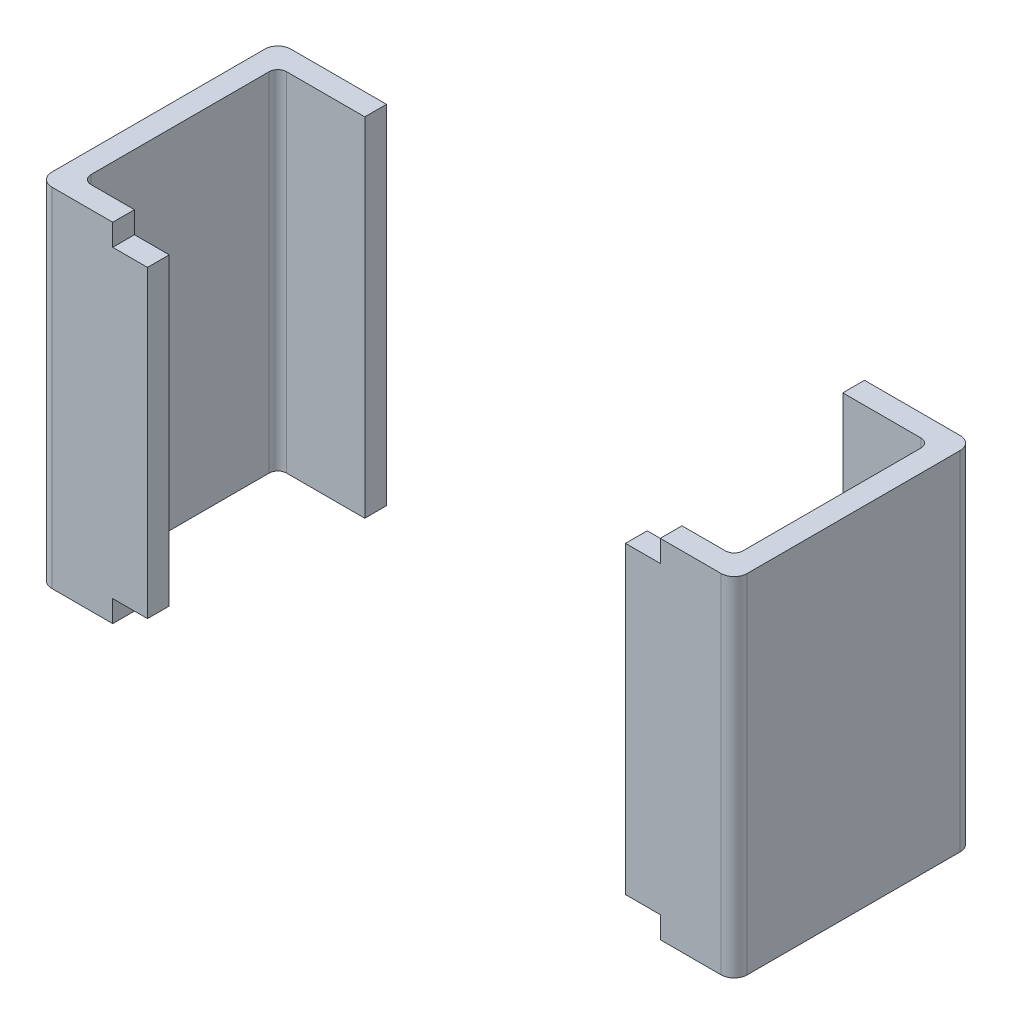
ISO-10303-21;
HEADER;
FILE_DESCRIPTION(('STEP AP214'),'2;1');
FILE_NAME('part.step','',(''),(''),'','','');
FILE_SCHEMA(('AUTOMOTIVE_DESIGN { 1 0 10303 214 1 1 1 1 }'));
ENDSEC;
DATA;
#1=APPLICATION_CONTEXT('core data for automotive mechanical design processes');
#2=APPLICATION_PROTOCOL_DEFINITION('international standard','automotive_design',2000,#1);
#3=PRODUCT_CONTEXT('',#1,'mechanical');
#4=PRODUCT('Part','Part','',(#3));
#5=PRODUCT_RELATED_PRODUCT_CATEGORY('part','',(#4));
#6=PRODUCT_DEFINITION_FORMATION('','',#4);
#7=PRODUCT_DEFINITION_CONTEXT('part definition',#1,'design');
#8=PRODUCT_DEFINITION('design','',#6,#7);
#9=PRODUCT_DEFINITION_SHAPE('','',#8);
#10=(LENGTH_UNIT() NAMED_UNIT(*) SI_UNIT(.MILLI.,.METRE.));
#11=(NAMED_UNIT(*) PLANE_ANGLE_UNIT() SI_UNIT($,.RADIAN.));
#12=(NAMED_UNIT(*) SI_UNIT($,.STERADIAN.) SOLID_ANGLE_UNIT());
#13=UNCERTAINTY_MEASURE_WITH_UNIT(LENGTH_MEASURE(1.E-05),#10,'distance_accuracy_value','');
#14=(GEOMETRIC_REPRESENTATION_CONTEXT(3) GLOBAL_UNCERTAINTY_ASSIGNED_CONTEXT((#13)) GLOBAL_UNIT_ASSIGNED_CONTEXT((#10,
#11,#12)) REPRESENTATION_CONTEXT('',''));
#15=CARTESIAN_POINT('',(0.,0.,0.));
#16=DIRECTION('',(0.,0.,1.));
#17=DIRECTION('',(1.,0.,0.));
#18=AXIS2_PLACEMENT_3D('',#15,#16,#17);
#19=CARTESIAN_POINT('',(-0.75,0.4,0.05));
#20=DIRECTION('',(-1.,0.,0.));
#21=DIRECTION('',(0.,1.,0.));
#22=AXIS2_PLACEMENT_3D('',#19,#20,#21);
#23=PLANE('',#22);
#24=DIRECTION('',(0.,-1.,0.));
#25=VECTOR('',#24,1.);
#26=CARTESIAN_POINT('',(-0.75,0.4,0.07));
#27=LINE('',#26,#25);
#28=CARTESIAN_POINT('',(-0.75,0.4,0.07));
#29=VERTEX_POINT('',#28);
#30=CARTESIAN_POINT('',(-0.75,-0.4,0.07));
#31=VERTEX_POINT('',#30);
#32=EDGE_CURVE('P0_E273',#29,#31,#27,.T.);
#33=ORIENTED_EDGE('',*,*,#32,.F.);
#34=DIRECTION('',(0.,0.,-1.));
#35=VECTOR('',#34,1.);
#36=CARTESIAN_POINT('',(-0.75,0.4,0.025));
#37=LINE('',#36,#35);
#38=CARTESIAN_POINT('',(-0.75,0.4,0.48));
#39=VERTEX_POINT('',#38);
#40=EDGE_CURVE('P0_E261',#39,#29,#37,.T.);
#41=ORIENTED_EDGE('',*,*,#40,.F.);
#42=DIRECTION('',(0.,1.,0.));
#43=VECTOR('',#42,1.);
#44=CARTESIAN_POINT('',(-0.75,0.4,0.48));
#45=LINE('',#44,#43);
#46=CARTESIAN_POINT('',(-0.75,-0.4,0.48));
#47=VERTEX_POINT('',#46);
#48=EDGE_CURVE('P0_E257',#47,#39,#45,.T.);
#49=ORIENTED_EDGE('',*,*,#48,.F.);
#50=DIRECTION('',(0.,0.,1.));
#51=VECTOR('',#50,1.);
#52=CARTESIAN_POINT('',(-0.75,-0.4,0.025));
#53=LINE('',#52,#51);
#54=EDGE_CURVE('P0_E303',#31,#47,#53,.T.);
#55=ORIENTED_EDGE('',*,*,#54,.F.);
#56=EDGE_LOOP('',(#33,#41,#49,#55));
#57=FACE_BOUND('',#56,.T.);
#58=ADVANCED_FACE('P0_F16',(#57),#23,.F.);
#59=CARTESIAN_POINT('',(-0.549982906312,0.497671248996,0.55));
#60=DIRECTION('',(-1.,0.,0.));
#61=DIRECTION('',(0.,0.,1.));
#62=AXIS2_PLACEMENT_3D('',#59,#60,#61);
#63=PLANE('',#62);
#64=DIRECTION('',(0.,0.,-1.));
#65=VECTOR('',#64,1.);
#66=CARTESIAN_POINT('',(-0.549982906312,-0.35,0.55));
#67=LINE('',#66,#65);
#68=CARTESIAN_POINT('',(-0.549982906312,-0.35,0.55));
#69=VERTEX_POINT('',#68);
#70=CARTESIAN_POINT('',(-0.549982906312,-0.35,0.5));
#71=VERTEX_POINT('',#70);
#72=EDGE_CURVE('P0_E204',#69,#71,#67,.T.);
#73=ORIENTED_EDGE('',*,*,#72,.T.);
#74=DIRECTION('',(0.,1.,0.));
#75=VECTOR('',#74,1.);
#76=CARTESIAN_POINT('',(-0.549982906312,0.448835624498,0.5));
#77=LINE('',#76,#75);
#78=CARTESIAN_POINT('',(-0.549982906312,0.35,0.5));
#79=VERTEX_POINT('',#78);
#80=EDGE_CURVE('P0_E221',#71,#79,#77,.T.);
#81=ORIENTED_EDGE('',*,*,#80,.T.);
#82=DIRECTION('',(0.,0.,1.));
#83=VECTOR('',#82,1.);
#84=CARTESIAN_POINT('',(-0.549982906312,0.35,0.55));
#85=LINE('',#84,#83);
#86=CARTESIAN_POINT('',(-0.549982906312,0.35,0.55));
#87=VERTEX_POINT('',#86);
#88=EDGE_CURVE('P0_E232',#79,#87,#85,.T.);
#89=ORIENTED_EDGE('',*,*,#88,.T.);
#90=DIRECTION('',(0.,1.,0.));
#91=VECTOR('',#90,1.);
#92=CARTESIAN_POINT('',(-0.549982906312,0.248835624498,0.55));
#93=LINE('',#92,#91);
#94=EDGE_CURVE('P0_E11',#69,#87,#93,.T.);
#95=ORIENTED_EDGE('',*,*,#94,.F.);
#96=EDGE_LOOP('',(#73,#81,#89,#95));
#97=FACE_BOUND('',#96,.T.);
#98=ADVANCED_FACE('P0_F344',(#97),#63,.F.);
#99=CARTESIAN_POINT('',(-0.549982906312,0.497671248996,0.55));
#100=DIRECTION('',(-1.,0.,0.));
#101=DIRECTION('',(0.,0.,1.));
#102=AXIS2_PLACEMENT_3D('',#99,#100,#101);
#103=PLANE('',#102);
#104=DIRECTION('',(0.,-1.,0.));
#105=VECTOR('',#104,1.);
#106=CARTESIAN_POINT('',(-0.549982906312,0.448835624498,0.05));
#107=LINE('',#106,#105);
#108=CARTESIAN_POINT('',(-0.549982906312,0.4,0.05));
#109=VERTEX_POINT('',#108);
#110=CARTESIAN_POINT('',(-0.549982906312,-0.4,0.05));
#111=VERTEX_POINT('',#110);
#112=EDGE_CURVE('P0_E89',#109,#111,#107,.T.);
#113=ORIENTED_EDGE('',*,*,#112,.T.);
#114=DIRECTION('',(0.,0.,1.));
#115=VECTOR('',#114,1.);
#116=CARTESIAN_POINT('',(-0.549982906312,-0.4,0.275));
#117=LINE('',#116,#115);
#118=CARTESIAN_POINT('',(-0.549982906312,-0.4,0.));
#119=VERTEX_POINT('',#118);
#120=EDGE_CURVE('P0_E238',#119,#111,#117,.T.);
#121=ORIENTED_EDGE('',*,*,#120,.F.);
#122=DIRECTION('',(0.,-1.,0.));
#123=VECTOR('',#122,1.);
#124=CARTESIAN_POINT('',(-0.549982906312,0.248835624498,0.));
#125=LINE('',#124,#123);
#126=CARTESIAN_POINT('',(-0.549982906312,0.4,0.));
#127=VERTEX_POINT('',#126);
#128=EDGE_CURVE('P0_E26',#127,#119,#125,.T.);
#129=ORIENTED_EDGE('',*,*,#128,.F.);
#130=DIRECTION('',(0.,0.,-1.));
#131=VECTOR('',#130,1.);
#132=CARTESIAN_POINT('',(-0.549982906312,0.4,0.275));
#133=LINE('',#132,#131);
#134=EDGE_CURVE('P0_E266',#109,#127,#133,.T.);
#135=ORIENTED_EDGE('',*,*,#134,.F.);
#136=EDGE_LOOP('',(#113,#121,#129,#135));
#137=FACE_BOUND('',#136,.T.);
#138=ADVANCED_FACE('P0_F380',(#137),#103,.F.);
#139=CARTESIAN_POINT('',(0.,0.,0.55));
#140=DIRECTION('',(0.,0.,1.));
#141=DIRECTION('',(1.,0.,0.));
#142=AXIS2_PLACEMENT_3D('',#139,#140,#141);
#143=PLANE('',#142);
#144=DIRECTION('',(1.,0.,0.));
#145=VECTOR('',#144,1.);
#146=CARTESIAN_POINT('',(-0.314991453156,-0.35,0.55));
#147=LINE('',#146,#145);
#148=CARTESIAN_POINT('',(-0.629982906312,-0.35,0.55));
#149=VERTEX_POINT('',#148);
#150=EDGE_CURVE('P0_E182',#149,#69,#147,.T.);
#151=ORIENTED_EDGE('',*,*,#150,.T.);
#152=ORIENTED_EDGE('',*,*,#94,.T.);
#153=DIRECTION('',(-1.,0.,0.));
#154=VECTOR('',#153,1.);
#155=CARTESIAN_POINT('',(-0.274991453156,0.35,0.55));
#156=LINE('',#155,#154);
#157=CARTESIAN_POINT('',(-0.629982906312,0.35,0.55));
#158=VERTEX_POINT('',#157);
#159=EDGE_CURVE('P0_E158',#87,#158,#156,.T.);
#160=ORIENTED_EDGE('',*,*,#159,.T.);
#161=DIRECTION('',(0.,1.,0.));
#162=VECTOR('',#161,1.);
#163=CARTESIAN_POINT('',(-0.629982906312,0.175,0.55));
#164=LINE('',#163,#162);
#165=CARTESIAN_POINT('',(-0.629982906312,0.4,0.55));
#166=VERTEX_POINT('',#165);
#167=EDGE_CURVE('P0_E282',#158,#166,#164,.T.);
#168=ORIENTED_EDGE('',*,*,#167,.T.);
#169=DIRECTION('',(-1.,0.,0.));
#170=VECTOR('',#169,1.);
#171=CARTESIAN_POINT('',(0.8,0.4,0.55));
#172=LINE('',#171,#170);
#173=CARTESIAN_POINT('',(-0.77,0.4,0.55));
#174=VERTEX_POINT('',#173);
#175=EDGE_CURVE('P0_E148',#166,#174,#172,.T.);
#176=ORIENTED_EDGE('',*,*,#175,.T.);
#177=DIRECTION('',(0.,1.,0.));
#178=VECTOR('',#177,1.);
#179=CARTESIAN_POINT('',(-0.77,0.2,0.55));
#180=LINE('',#179,#178);
#181=CARTESIAN_POINT('',(-0.77,-0.4,0.55));
#182=VERTEX_POINT('',#181);
#183=EDGE_CURVE('P0_E40',#182,#174,#180,.T.);
#184=ORIENTED_EDGE('',*,*,#183,.F.);
#185=DIRECTION('',(1.,0.,0.));
#186=VECTOR('',#185,1.);
#187=CARTESIAN_POINT('',(-0.8,-0.4,0.55));
#188=LINE('',#187,#186);
#189=CARTESIAN_POINT('',(-0.629982906312,-0.4,0.55));
#190=VERTEX_POINT('',#189);
#191=EDGE_CURVE('P0_E185',#182,#190,#188,.T.);
#192=ORIENTED_EDGE('',*,*,#191,.T.);
#193=DIRECTION('',(0.,1.,0.));
#194=VECTOR('',#193,1.);
#195=CARTESIAN_POINT('',(-0.629982906312,-0.2,0.55));
#196=LINE('',#195,#194);
#197=EDGE_CURVE('P0_E178',#190,#149,#196,.T.);
#198=ORIENTED_EDGE('',*,*,#197,.T.);
#199=EDGE_LOOP('',(#151,#152,#160,#168,#176,#184,#192,#198));
#200=FACE_BOUND('',#199,.T.);
#201=ADVANCED_FACE('P0_F180',(#200),#143,.T.);
#202=CARTESIAN_POINT('',(0.,0.,0.));
#203=DIRECTION('',(0.,0.,1.));
#204=DIRECTION('',(1.,0.,0.));
#205=AXIS2_PLACEMENT_3D('',#202,#203,#204);
#206=PLANE('',#205);
#207=DIRECTION('',(0.,-1.,0.));
#208=VECTOR('',#207,1.);
#209=CARTESIAN_POINT('',(-0.77,0.2,0.));
#210=LINE('',#209,#208);
#211=CARTESIAN_POINT('',(-0.77,0.4,0.));
#212=VERTEX_POINT('',#211);
#213=CARTESIAN_POINT('',(-0.77,-0.4,0.));
#214=VERTEX_POINT('',#213);
#215=EDGE_CURVE('P0_E220',#212,#214,#210,.T.);
#216=ORIENTED_EDGE('',*,*,#215,.F.);
#217=DIRECTION('',(-1.,0.,0.));
#218=VECTOR('',#217,1.);
#219=CARTESIAN_POINT('',(0.8,0.4,0.));
#220=LINE('',#219,#218);
#221=EDGE_CURVE('P0_E262',#127,#212,#220,.T.);
#222=ORIENTED_EDGE('',*,*,#221,.F.);
#223=ORIENTED_EDGE('',*,*,#128,.T.);
#224=DIRECTION('',(1.,0.,0.));
#225=VECTOR('',#224,1.);
#226=CARTESIAN_POINT('',(-0.8,-0.4,0.));
#227=LINE('',#226,#225);
#228=EDGE_CURVE('P0_E234',#214,#119,#227,.T.);
#229=ORIENTED_EDGE('',*,*,#228,.F.);
#230=EDGE_LOOP('',(#216,#222,#223,#229));
#231=FACE_BOUND('',#230,.T.);
#232=ADVANCED_FACE('P0_F385',(#231),#206,.F.);
#233=CARTESIAN_POINT('',(-0.73,0.4,0.48));
#234=DIRECTION('',(0.,-1.,0.));
#235=DIRECTION('',(-0.707106781186548,0.,0.707106781186548));
#236=AXIS2_PLACEMENT_3D('',#233,#234,#235);
#237=CYLINDRICAL_SURFACE('',#236,0.02);
#238=CARTESIAN_POINT('',(-0.73,0.4,0.48));
#239=DIRECTION('',(0.,1.,0.));
#240=DIRECTION('',(-0.707106781186548,0.,0.707106781186548));
#241=AXIS2_PLACEMENT_3D('',#238,#239,#240);
#242=CIRCLE('',#241,0.02);
#243=CARTESIAN_POINT('',(-0.73,0.4,0.5));
#244=VERTEX_POINT('',#243);
#245=EDGE_CURVE('P0_E249',#39,#244,#242,.T.);
#246=ORIENTED_EDGE('',*,*,#245,.T.);
#247=DIRECTION('',(0.,-1.,0.));
#248=VECTOR('',#247,1.);
#249=CARTESIAN_POINT('',(-0.73,0.4,0.5));
#250=LINE('',#249,#248);
#251=CARTESIAN_POINT('',(-0.73,-0.4,0.5));
#252=VERTEX_POINT('',#251);
#253=EDGE_CURVE('P0_E251',#244,#252,#250,.T.);
#254=ORIENTED_EDGE('',*,*,#253,.T.);
#255=CARTESIAN_POINT('',(-0.73,-0.4,0.48));
#256=DIRECTION('',(0.,-1.,0.));
#257=DIRECTION('',(-0.707106781186548,0.,0.707106781186548));
#258=AXIS2_PLACEMENT_3D('',#255,#256,#257);
#259=CIRCLE('',#258,0.02);
#260=EDGE_CURVE('P0_E307',#252,#47,#259,.T.);
#261=ORIENTED_EDGE('',*,*,#260,.T.);
#262=ORIENTED_EDGE('',*,*,#48,.T.);
#263=EDGE_LOOP('',(#246,#254,#261,#262));
#264=FACE_BOUND('',#263,.T.);
#265=ADVANCED_FACE('P0_F397',(#264),#237,.F.);
#266=CARTESIAN_POINT('',(0.75,0.4,0.05));
#267=DIRECTION('',(0.,0.,-1.));
#268=DIRECTION('',(-1.,0.,0.));
#269=AXIS2_PLACEMENT_3D('',#266,#267,#268);
#270=PLANE('',#269);
#271=ORIENTED_EDGE('',*,*,#112,.F.);
#272=DIRECTION('',(1.,0.,0.));
#273=VECTOR('',#272,1.);
#274=CARTESIAN_POINT('',(0.775,0.4,0.05));
#275=LINE('',#274,#273);
#276=CARTESIAN_POINT('',(-0.73,0.4,0.05));
#277=VERTEX_POINT('',#276);
#278=EDGE_CURVE('P0_E311',#277,#109,#275,.T.);
#279=ORIENTED_EDGE('',*,*,#278,.F.);
#280=DIRECTION('',(0.,1.,0.));
#281=VECTOR('',#280,1.);
#282=CARTESIAN_POINT('',(-0.73,0.4,0.05));
#283=LINE('',#282,#281);
#284=CARTESIAN_POINT('',(-0.73,-0.4,0.05));
#285=VERTEX_POINT('',#284);
#286=EDGE_CURVE('P0_E229',#285,#277,#283,.T.);
#287=ORIENTED_EDGE('',*,*,#286,.F.);
#288=DIRECTION('',(-1.,0.,0.));
#289=VECTOR('',#288,1.);
#290=CARTESIAN_POINT('',(-0.025,-0.4,0.05));
#291=LINE('',#290,#289);
#292=EDGE_CURVE('P0_E300',#111,#285,#291,.T.);
#293=ORIENTED_EDGE('',*,*,#292,.F.);
#294=EDGE_LOOP('',(#271,#279,#287,#293));
#295=FACE_BOUND('',#294,.T.);
#296=ADVANCED_FACE('P0_F381',(#295),#270,.F.);
#297=CARTESIAN_POINT('',(-0.73,0.4,0.07));
#298=DIRECTION('',(0.,1.,0.));
#299=DIRECTION('',(-0.707106781186548,0.,-0.707106781186548));
#300=AXIS2_PLACEMENT_3D('',#297,#298,#299);
#301=CYLINDRICAL_SURFACE('',#300,0.02);
#302=CARTESIAN_POINT('',(-0.73,-0.4,0.07));
#303=DIRECTION('',(0.,-1.,0.));
#304=DIRECTION('',(-0.707106781186548,0.,-0.707106781186548));
#305=AXIS2_PLACEMENT_3D('',#302,#303,#304);
#306=CIRCLE('',#305,0.02);
#307=EDGE_CURVE('P0_E308',#31,#285,#306,.T.);
#308=ORIENTED_EDGE('',*,*,#307,.T.);
#309=ORIENTED_EDGE('',*,*,#286,.T.);
#310=CARTESIAN_POINT('',(-0.73,0.4,0.07));
#311=DIRECTION('',(0.,1.,0.));
#312=DIRECTION('',(-0.707106781186548,0.,-0.707106781186548));
#313=AXIS2_PLACEMENT_3D('',#310,#311,#312);
#314=CIRCLE('',#313,0.02);
#315=EDGE_CURVE('P0_E289',#277,#29,#314,.T.);
#316=ORIENTED_EDGE('',*,*,#315,.T.);
#317=ORIENTED_EDGE('',*,*,#32,.T.);
#318=EDGE_LOOP('',(#308,#309,#316,#317));
#319=FACE_BOUND('',#318,.T.);
#320=ADVANCED_FACE('P0_F391',(#319),#301,.F.);
#321=CARTESIAN_POINT('',(-0.77,0.2,0.52));
#322=DIRECTION('',(0.,-1.,0.));
#323=DIRECTION('',(-0.707106781186548,0.,0.707106781186548));
#324=AXIS2_PLACEMENT_3D('',#321,#322,#323);
#325=CYLINDRICAL_SURFACE('',#324,0.03);
#326=CARTESIAN_POINT('',(-0.77,-0.4,0.52));
#327=DIRECTION('',(0.,1.,0.));
#328=DIRECTION('',(-0.707106781186548,0.,0.707106781186548));
#329=AXIS2_PLACEMENT_3D('',#326,#327,#328);
#330=CIRCLE('',#329,0.03);
#331=CARTESIAN_POINT('',(-0.8,-0.4,0.52));
#332=VERTEX_POINT('',#331);
#333=EDGE_CURVE('P0_E231',#332,#182,#330,.T.);
#334=ORIENTED_EDGE('',*,*,#333,.T.);
#335=ORIENTED_EDGE('',*,*,#183,.T.);
#336=CARTESIAN_POINT('',(-0.77,0.4,0.52));
#337=DIRECTION('',(0.,-1.,0.));
#338=DIRECTION('',(-0.707106781186548,0.,0.707106781186548));
#339=AXIS2_PLACEMENT_3D('',#336,#337,#338);
#340=CIRCLE('',#339,0.03);
#341=CARTESIAN_POINT('',(-0.8,0.4,0.52));
#342=VERTEX_POINT('',#341);
#343=EDGE_CURVE('P0_E269',#174,#342,#340,.T.);
#344=ORIENTED_EDGE('',*,*,#343,.T.);
#345=DIRECTION('',(0.,-1.,0.));
#346=VECTOR('',#345,1.);
#347=CARTESIAN_POINT('',(-0.8,0.2,0.52));
#348=LINE('',#347,#346);
#349=EDGE_CURVE('P0_E215',#342,#332,#348,.T.);
#350=ORIENTED_EDGE('',*,*,#349,.T.);
#351=EDGE_LOOP('',(#334,#335,#344,#350));
#352=FACE_BOUND('',#351,.T.);
#353=ADVANCED_FACE('P0_F356',(#352),#325,.T.);
#354=CARTESIAN_POINT('',(-0.8,0.4,0.));
#355=DIRECTION('',(-1.,0.,0.));
#356=DIRECTION('',(0.,0.,1.));
#357=AXIS2_PLACEMENT_3D('',#354,#355,#356);
#358=PLANE('',#357);
#359=DIRECTION('',(0.,1.,0.));
#360=VECTOR('',#359,1.);
#361=CARTESIAN_POINT('',(-0.8,0.2,0.03));
#362=LINE('',#361,#360);
#363=CARTESIAN_POINT('',(-0.8,-0.4,0.03));
#364=VERTEX_POINT('',#363);
#365=CARTESIAN_POINT('',(-0.8,0.4,0.03));
#366=VERTEX_POINT('',#365);
#367=EDGE_CURVE('P0_E217',#364,#366,#362,.T.);
#368=ORIENTED_EDGE('',*,*,#367,.F.);
#369=DIRECTION('',(0.,0.,1.));
#370=VECTOR('',#369,1.);
#371=CARTESIAN_POINT('',(-0.8,-0.4,0.));
#372=LINE('',#371,#370);
#373=EDGE_CURVE('P0_E275',#364,#332,#372,.T.);
#374=ORIENTED_EDGE('',*,*,#373,.T.);
#375=ORIENTED_EDGE('',*,*,#349,.F.);
#376=DIRECTION('',(0.,0.,1.));
#377=VECTOR('',#376,1.);
#378=CARTESIAN_POINT('',(-0.8,0.4,0.));
#379=LINE('',#378,#377);
#380=EDGE_CURVE('P0_E321',#366,#342,#379,.T.);
#381=ORIENTED_EDGE('',*,*,#380,.F.);
#382=EDGE_LOOP('',(#368,#374,#375,#381));
#383=FACE_BOUND('',#382,.T.);
#384=ADVANCED_FACE('P0_F361',(#383),#358,.T.);
#385=CARTESIAN_POINT('',(-0.77,0.2,0.03));
#386=DIRECTION('',(0.,-1.,0.));
#387=DIRECTION('',(-0.707106781186548,0.,-0.707106781186548));
#388=AXIS2_PLACEMENT_3D('',#385,#386,#387);
#389=CYLINDRICAL_SURFACE('',#388,0.03);
#390=CARTESIAN_POINT('',(-0.77,-0.4,0.03));
#391=DIRECTION('',(0.,1.,0.));
#392=DIRECTION('',(-0.707106781186548,0.,-0.707106781186548));
#393=AXIS2_PLACEMENT_3D('',#390,#391,#392);
#394=CIRCLE('',#393,0.03);
#395=EDGE_CURVE('P0_E239',#214,#364,#394,.T.);
#396=ORIENTED_EDGE('',*,*,#395,.T.);
#397=ORIENTED_EDGE('',*,*,#367,.T.);
#398=CARTESIAN_POINT('',(-0.77,0.4,0.03));
#399=DIRECTION('',(0.,-1.,0.));
#400=DIRECTION('',(-0.707106781186548,0.,-0.707106781186548));
#401=AXIS2_PLACEMENT_3D('',#398,#399,#400);
#402=CIRCLE('',#401,0.03);
#403=EDGE_CURVE('P0_E19',#366,#212,#402,.T.);
#404=ORIENTED_EDGE('',*,*,#403,.T.);
#405=ORIENTED_EDGE('',*,*,#215,.T.);
#406=EDGE_LOOP('',(#396,#397,#404,#405));
#407=FACE_BOUND('',#406,.T.);
#408=ADVANCED_FACE('P0_F478',(#407),#389,.T.);
#409=CARTESIAN_POINT('',(-0.75,0.4,0.5));
#410=DIRECTION('',(0.,0.,1.));
#411=DIRECTION('',(1.,0.,0.));
#412=AXIS2_PLACEMENT_3D('',#409,#410,#411);
#413=PLANE('',#412);
#414=DIRECTION('',(-1.,0.,0.));
#415=VECTOR('',#414,1.);
#416=CARTESIAN_POINT('',(-0.689991453156,-0.35,0.5));
#417=LINE('',#416,#415);
#418=CARTESIAN_POINT('',(-0.629982906312,-0.35,0.5));
#419=VERTEX_POINT('',#418);
#420=EDGE_CURVE('P0_E211',#71,#419,#417,.T.);
#421=ORIENTED_EDGE('',*,*,#420,.T.);
#422=DIRECTION('',(0.,-1.,0.));
#423=VECTOR('',#422,1.);
#424=CARTESIAN_POINT('',(-0.629982906312,0.,0.5));
#425=LINE('',#424,#423);
#426=CARTESIAN_POINT('',(-0.629982906312,-0.4,0.5));
#427=VERTEX_POINT('',#426);
#428=EDGE_CURVE('P0_E191',#419,#427,#425,.T.);
#429=ORIENTED_EDGE('',*,*,#428,.T.);
#430=DIRECTION('',(1.,0.,0.));
#431=VECTOR('',#430,1.);
#432=CARTESIAN_POINT('',(-0.775,-0.4,0.5));
#433=LINE('',#432,#431);
#434=EDGE_CURVE('P0_E250',#252,#427,#433,.T.);
#435=ORIENTED_EDGE('',*,*,#434,.F.);
#436=ORIENTED_EDGE('',*,*,#253,.F.);
#437=DIRECTION('',(-1.,0.,0.));
#438=VECTOR('',#437,1.);
#439=CARTESIAN_POINT('',(0.025,0.4,0.5));
#440=LINE('',#439,#438);
#441=CARTESIAN_POINT('',(-0.629982906312,0.4,0.5));
#442=VERTEX_POINT('',#441);
#443=EDGE_CURVE('P0_E245',#442,#244,#440,.T.);
#444=ORIENTED_EDGE('',*,*,#443,.F.);
#445=DIRECTION('',(0.,-1.,0.));
#446=VECTOR('',#445,1.);
#447=CARTESIAN_POINT('',(-0.629982906312,0.375,0.5));
#448=LINE('',#447,#446);
#449=CARTESIAN_POINT('',(-0.629982906312,0.35,0.5));
#450=VERTEX_POINT('',#449);
#451=EDGE_CURVE('P0_E242',#442,#450,#448,.T.);
#452=ORIENTED_EDGE('',*,*,#451,.T.);
#453=DIRECTION('',(1.,0.,0.));
#454=VECTOR('',#453,1.);
#455=CARTESIAN_POINT('',(-0.649991453156,0.35,0.5));
#456=LINE('',#455,#454);
#457=EDGE_CURVE('P0_E222',#450,#79,#456,.T.);
#458=ORIENTED_EDGE('',*,*,#457,.T.);
#459=ORIENTED_EDGE('',*,*,#80,.F.);
#460=EDGE_LOOP('',(#421,#429,#435,#436,#444,#452,#458,#459));
#461=FACE_BOUND('',#460,.T.);
#462=ADVANCED_FACE('P0_F368',(#461),#413,.F.);
#463=CARTESIAN_POINT('',(0.8,0.4,0.));
#464=DIRECTION('',(0.,1.,0.));
#465=DIRECTION('',(1.,0.,0.));
#466=AXIS2_PLACEMENT_3D('',#463,#464,#465);
#467=PLANE('',#466);
#468=DIRECTION('',(0.,0.,-1.));
#469=VECTOR('',#468,1.);
#470=CARTESIAN_POINT('',(-0.629982906312,0.4,0.275));
#471=LINE('',#470,#469);
#472=EDGE_CURVE('P0_E279',#166,#442,#471,.T.);
#473=ORIENTED_EDGE('',*,*,#472,.T.);
#474=ORIENTED_EDGE('',*,*,#443,.T.);
#475=ORIENTED_EDGE('',*,*,#245,.F.);
#476=ORIENTED_EDGE('',*,*,#40,.T.);
#477=ORIENTED_EDGE('',*,*,#315,.F.);
#478=ORIENTED_EDGE('',*,*,#278,.T.);
#479=ORIENTED_EDGE('',*,*,#134,.T.);
#480=ORIENTED_EDGE('',*,*,#221,.T.);
#481=ORIENTED_EDGE('',*,*,#403,.F.);
#482=ORIENTED_EDGE('',*,*,#380,.T.);
#483=ORIENTED_EDGE('',*,*,#343,.F.);
#484=ORIENTED_EDGE('',*,*,#175,.F.);
#485=EDGE_LOOP('',(#473,#474,#475,#476,#477,#478,#479,#480,#481,#482,#483,#484));
#486=FACE_BOUND('',#485,.T.);
#487=ADVANCED_FACE('P0_F353',(#486),#467,.T.);
#488=CARTESIAN_POINT('',(-0.8,-0.4,0.));
#489=DIRECTION('',(0.,-1.,0.));
#490=DIRECTION('',(0.,0.,-1.));
#491=AXIS2_PLACEMENT_3D('',#488,#489,#490);
#492=PLANE('',#491);
#493=DIRECTION('',(0.,0.,1.));
#494=VECTOR('',#493,1.);
#495=CARTESIAN_POINT('',(-0.629982906312,-0.4,0.275));
#496=LINE('',#495,#494);
#497=EDGE_CURVE('P0_E190',#427,#190,#496,.T.);
#498=ORIENTED_EDGE('',*,*,#497,.T.);
#499=ORIENTED_EDGE('',*,*,#191,.F.);
#500=ORIENTED_EDGE('',*,*,#333,.F.);
#501=ORIENTED_EDGE('',*,*,#373,.F.);
#502=ORIENTED_EDGE('',*,*,#395,.F.);
#503=ORIENTED_EDGE('',*,*,#228,.T.);
#504=ORIENTED_EDGE('',*,*,#120,.T.);
#505=ORIENTED_EDGE('',*,*,#292,.T.);
#506=ORIENTED_EDGE('',*,*,#307,.F.);
#507=ORIENTED_EDGE('',*,*,#54,.T.);
#508=ORIENTED_EDGE('',*,*,#260,.F.);
#509=ORIENTED_EDGE('',*,*,#434,.T.);
#510=EDGE_LOOP('',(#498,#499,#500,#501,#502,#503,#504,#505,#506,#507,#508,#509));
#511=FACE_BOUND('',#510,.T.);
#512=ADVANCED_FACE('P0_F364',(#511),#492,.T.);
#513=CARTESIAN_POINT('',(-0.549982906312,0.35,0.55));
#514=DIRECTION('',(0.,-1.,0.));
#515=DIRECTION('',(0.,0.,-1.));
#516=AXIS2_PLACEMENT_3D('',#513,#514,#515);
#517=PLANE('',#516);
#518=ORIENTED_EDGE('',*,*,#457,.F.);
#519=DIRECTION('',(0.,0.,-1.));
#520=VECTOR('',#519,1.);
#521=CARTESIAN_POINT('',(-0.629982906312,0.35,0.55));
#522=LINE('',#521,#520);
#523=EDGE_CURVE('P0_E226',#158,#450,#522,.T.);
#524=ORIENTED_EDGE('',*,*,#523,.F.);
#525=ORIENTED_EDGE('',*,*,#159,.F.);
#526=ORIENTED_EDGE('',*,*,#88,.F.);
#527=EDGE_LOOP('',(#518,#524,#525,#526));
#528=FACE_BOUND('',#527,.T.);
#529=ADVANCED_FACE('P0_F346',(#528),#517,.F.);
#530=CARTESIAN_POINT('',(-0.629982906312,0.35,0.55));
#531=DIRECTION('',(-1.,0.,0.));
#532=DIRECTION('',(0.,0.,1.));
#533=AXIS2_PLACEMENT_3D('',#530,#531,#532);
#534=PLANE('',#533);
#535=ORIENTED_EDGE('',*,*,#451,.F.);
#536=ORIENTED_EDGE('',*,*,#472,.F.);
#537=ORIENTED_EDGE('',*,*,#167,.F.);
#538=ORIENTED_EDGE('',*,*,#523,.T.);
#539=EDGE_LOOP('',(#535,#536,#537,#538));
#540=FACE_BOUND('',#539,.T.);
#541=ADVANCED_FACE('P0_F351',(#540),#534,.F.);
#542=CARTESIAN_POINT('',(-0.629982906312,-0.4,0.55));
#543=DIRECTION('',(-1.,0.,0.));
#544=DIRECTION('',(0.,0.,1.));
#545=AXIS2_PLACEMENT_3D('',#542,#543,#544);
#546=PLANE('',#545);
#547=ORIENTED_EDGE('',*,*,#428,.F.);
#548=DIRECTION('',(0.,0.,-1.));
#549=VECTOR('',#548,1.);
#550=CARTESIAN_POINT('',(-0.629982906312,-0.35,0.55));
#551=LINE('',#550,#549);
#552=EDGE_CURVE('P0_E194',#149,#419,#551,.T.);
#553=ORIENTED_EDGE('',*,*,#552,.F.);
#554=ORIENTED_EDGE('',*,*,#197,.F.);
#555=ORIENTED_EDGE('',*,*,#497,.F.);
#556=EDGE_LOOP('',(#547,#553,#554,#555));
#557=FACE_BOUND('',#556,.T.);
#558=ADVANCED_FACE('P0_F195',(#557),#546,.F.);
#559=CARTESIAN_POINT('',(-0.629982906312,-0.35,0.55));
#560=DIRECTION('',(0.,1.,0.));
#561=DIRECTION('',(1.,0.,0.));
#562=AXIS2_PLACEMENT_3D('',#559,#560,#561);
#563=PLANE('',#562);
#564=ORIENTED_EDGE('',*,*,#420,.F.);
#565=ORIENTED_EDGE('',*,*,#72,.F.);
#566=ORIENTED_EDGE('',*,*,#150,.F.);
#567=ORIENTED_EDGE('',*,*,#552,.T.);
#568=EDGE_LOOP('',(#564,#565,#566,#567));
#569=FACE_BOUND('',#568,.T.);
#570=ADVANCED_FACE('P0_F202',(#569),#563,.F.);
#571=CLOSED_SHELL('',(#58,#98,#138,#201,#232,#265,#296,#320,#353,#384,#408,#462,#487,#512,#529,
#541,#558,#570));
#572=MANIFOLD_SOLID_BREP('P0_B1',#571);
#573=CARTESIAN_POINT('',(0.,0.,0.55));
#574=DIRECTION('',(0.,0.,1.));
#575=DIRECTION('',(1.,0.,0.));
#576=AXIS2_PLACEMENT_3D('',#573,#574,#575);
#577=PLANE('',#576);
#578=DIRECTION('',(0.,-1.,0.));
#579=VECTOR('',#578,1.);
#580=CARTESIAN_POINT('',(0.629982906312,-0.175,0.55));
#581=LINE('',#580,#579);
#582=CARTESIAN_POINT('',(0.629982906312,-0.35,0.55));
#583=VERTEX_POINT('',#582);
#584=CARTESIAN_POINT('',(0.629982906312,-0.4,0.55));
#585=VERTEX_POINT('',#584);
#586=EDGE_CURVE('P1_E232',#583,#585,#581,.T.);
#587=ORIENTED_EDGE('',*,*,#586,.T.);
#588=DIRECTION('',(1.,0.,0.));
#589=VECTOR('',#588,1.);
#590=CARTESIAN_POINT('',(-0.8,-0.4,0.55));
#591=LINE('',#590,#589);
#592=CARTESIAN_POINT('',(0.77,-0.4,0.55));
#593=VERTEX_POINT('',#592);
#594=EDGE_CURVE('P1_E277',#585,#593,#591,.T.);
#595=ORIENTED_EDGE('',*,*,#594,.T.);
#596=DIRECTION('',(0.,-1.,0.));
#597=VECTOR('',#596,1.);
#598=CARTESIAN_POINT('',(0.77,-0.2,0.55));
#599=LINE('',#598,#597);
#600=CARTESIAN_POINT('',(0.77,0.4,0.55));
#601=VERTEX_POINT('',#600);
#602=EDGE_CURVE('P1_E245',#601,#593,#599,.T.);
#603=ORIENTED_EDGE('',*,*,#602,.F.);
#604=DIRECTION('',(-1.,0.,0.));
#605=VECTOR('',#604,1.);
#606=CARTESIAN_POINT('',(0.8,0.4,0.55));
#607=LINE('',#606,#605);
#608=CARTESIAN_POINT('',(0.629982906312,0.4,0.55));
#609=VERTEX_POINT('',#608);
#610=EDGE_CURVE('P1_E27',#601,#609,#607,.T.);
#611=ORIENTED_EDGE('',*,*,#610,.T.);
#612=DIRECTION('',(0.,-1.,0.));
#613=VECTOR('',#612,1.);
#614=CARTESIAN_POINT('',(0.629982906312,0.2,0.55));
#615=LINE('',#614,#613);
#616=CARTESIAN_POINT('',(0.629982906312,0.35,0.55));
#617=VERTEX_POINT('',#616);
#618=EDGE_CURVE('P1_E190',#609,#617,#615,.T.);
#619=ORIENTED_EDGE('',*,*,#618,.T.);
#620=DIRECTION('',(-1.,0.,0.));
#621=VECTOR('',#620,1.);
#622=CARTESIAN_POINT('',(0.314991453156,0.35,0.55));
#623=LINE('',#622,#621);
#624=CARTESIAN_POINT('',(0.549982906312,0.35,0.55));
#625=VERTEX_POINT('',#624);
#626=EDGE_CURVE('P1_E206',#617,#625,#623,.T.);
#627=ORIENTED_EDGE('',*,*,#626,.T.);
#628=DIRECTION('',(0.,-1.,0.));
#629=VECTOR('',#628,1.);
#630=CARTESIAN_POINT('',(0.549982906312,-0.248835624498,0.55));
#631=LINE('',#630,#629);
#632=CARTESIAN_POINT('',(0.549982906312,-0.35,0.55));
#633=VERTEX_POINT('',#632);
#634=EDGE_CURVE('P1_E123',#625,#633,#631,.T.);
#635=ORIENTED_EDGE('',*,*,#634,.T.);
#636=DIRECTION('',(1.,0.,0.));
#637=VECTOR('',#636,1.);
#638=CARTESIAN_POINT('',(0.274991453156,-0.35,0.55));
#639=LINE('',#638,#637);
#640=EDGE_CURVE('P1_E214',#633,#583,#639,.T.);
#641=ORIENTED_EDGE('',*,*,#640,.T.);
#642=EDGE_LOOP('',(#587,#595,#603,#611,#619,#627,#635,#641));
#643=FACE_BOUND('',#642,.T.);
#644=ADVANCED_FACE('P1_F16',(#643),#577,.T.);
#645=CARTESIAN_POINT('',(0.,0.,0.));
#646=DIRECTION('',(0.,0.,1.));
#647=DIRECTION('',(1.,0.,0.));
#648=AXIS2_PLACEMENT_3D('',#645,#646,#647);
#649=PLANE('',#648);
#650=DIRECTION('',(0.,1.,0.));
#651=VECTOR('',#650,1.);
#652=CARTESIAN_POINT('',(0.77,-0.2,0.));
#653=LINE('',#652,#651);
#654=CARTESIAN_POINT('',(0.77,-0.4,0.));
#655=VERTEX_POINT('',#654);
#656=CARTESIAN_POINT('',(0.77,0.4,0.));
#657=VERTEX_POINT('',#656);
#658=EDGE_CURVE('P1_E231',#655,#657,#653,.T.);
#659=ORIENTED_EDGE('',*,*,#658,.F.);
#660=DIRECTION('',(1.,0.,0.));
#661=VECTOR('',#660,1.);
#662=CARTESIAN_POINT('',(-0.8,-0.4,0.));
#663=LINE('',#662,#661);
#664=CARTESIAN_POINT('',(0.549982906312,-0.4,0.));
#665=VERTEX_POINT('',#664);
#666=EDGE_CURVE('P1_E246',#665,#655,#663,.T.);
#667=ORIENTED_EDGE('',*,*,#666,.F.);
#668=DIRECTION('',(0.,1.,0.));
#669=VECTOR('',#668,1.);
#670=CARTESIAN_POINT('',(0.549982906312,-0.248835624498,0.));
#671=LINE('',#670,#669);
#672=CARTESIAN_POINT('',(0.549982906312,0.4,0.));
#673=VERTEX_POINT('',#672);
#674=EDGE_CURVE('P1_E240',#665,#673,#671,.T.);
#675=ORIENTED_EDGE('',*,*,#674,.T.);
#676=DIRECTION('',(-1.,0.,0.));
#677=VECTOR('',#676,1.);
#678=CARTESIAN_POINT('',(0.8,0.4,0.));
#679=LINE('',#678,#677);
#680=EDGE_CURVE('P1_E11',#657,#673,#679,.T.);
#681=ORIENTED_EDGE('',*,*,#680,.F.);
#682=EDGE_LOOP('',(#659,#667,#675,#681));
#683=FACE_BOUND('',#682,.T.);
#684=ADVANCED_FACE('P1_F359',(#683),#649,.F.);
#685=CARTESIAN_POINT('',(0.8,0.4,0.));
#686=DIRECTION('',(0.,1.,0.));
#687=DIRECTION('',(1.,0.,0.));
#688=AXIS2_PLACEMENT_3D('',#685,#686,#687);
#689=PLANE('',#688);
#690=DIRECTION('',(0.,0.,1.));
#691=VECTOR('',#690,1.);
#692=CARTESIAN_POINT('',(0.629982906312,0.4,0.275));
#693=LINE('',#692,#691);
#694=CARTESIAN_POINT('',(0.629982906312,0.4,0.5));
#695=VERTEX_POINT('',#694);
#696=EDGE_CURVE('P1_E179',#695,#609,#693,.T.);
#697=ORIENTED_EDGE('',*,*,#696,.T.);
#698=ORIENTED_EDGE('',*,*,#610,.F.);
#699=CARTESIAN_POINT('',(0.77,0.4,0.52));
#700=DIRECTION('',(0.,-1.,0.));
#701=DIRECTION('',(0.707106781186548,0.,0.707106781186548));
#702=AXIS2_PLACEMENT_3D('',#699,#700,#701);
#703=CIRCLE('',#702,0.03);
#704=CARTESIAN_POINT('',(0.8,0.4,0.52));
#705=VERTEX_POINT('',#704);
#706=EDGE_CURVE('P1_E256',#705,#601,#703,.T.);
#707=ORIENTED_EDGE('',*,*,#706,.F.);
#708=DIRECTION('',(0.,0.,1.));
#709=VECTOR('',#708,1.);
#710=CARTESIAN_POINT('',(0.8,0.4,0.));
#711=LINE('',#710,#709);
#712=CARTESIAN_POINT('',(0.8,0.4,0.03));
#713=VERTEX_POINT('',#712);
#714=EDGE_CURVE('P1_E226',#713,#705,#711,.T.);
#715=ORIENTED_EDGE('',*,*,#714,.F.);
#716=CARTESIAN_POINT('',(0.77,0.4,0.03));
#717=DIRECTION('',(0.,-1.,0.));
#718=DIRECTION('',(0.707106781186548,0.,-0.707106781186548));
#719=AXIS2_PLACEMENT_3D('',#716,#717,#718);
#720=CIRCLE('',#719,0.03);
#721=EDGE_CURVE('P1_E268',#657,#713,#720,.T.);
#722=ORIENTED_EDGE('',*,*,#721,.F.);
#723=ORIENTED_EDGE('',*,*,#680,.T.);
#724=DIRECTION('',(0.,0.,1.));
#725=VECTOR('',#724,1.);
#726=CARTESIAN_POINT('',(0.549982906312,0.4,0.275));
#727=LINE('',#726,#725);
#728=CARTESIAN_POINT('',(0.549982906312,0.4,0.05));
#729=VERTEX_POINT('',#728);
#730=EDGE_CURVE('P1_E272',#673,#729,#727,.T.);
#731=ORIENTED_EDGE('',*,*,#730,.T.);
#732=DIRECTION('',(1.,0.,0.));
#733=VECTOR('',#732,1.);
#734=CARTESIAN_POINT('',(0.775,0.4,0.05));
#735=LINE('',#734,#733);
#736=CARTESIAN_POINT('',(0.73,0.4,0.05));
#737=VERTEX_POINT('',#736);
#738=EDGE_CURVE('P1_E215',#729,#737,#735,.T.);
#739=ORIENTED_EDGE('',*,*,#738,.T.);
#740=CARTESIAN_POINT('',(0.73,0.4,0.07));
#741=DIRECTION('',(0.,1.,0.));
#742=DIRECTION('',(0.707106781186548,0.,-0.707106781186548));
#743=AXIS2_PLACEMENT_3D('',#740,#741,#742);
#744=CIRCLE('',#743,0.02);
#745=CARTESIAN_POINT('',(0.75,0.4,0.07));
#746=VERTEX_POINT('',#745);
#747=EDGE_CURVE('P1_E295',#746,#737,#744,.T.);
#748=ORIENTED_EDGE('',*,*,#747,.F.);
#749=DIRECTION('',(0.,0.,1.));
#750=VECTOR('',#749,1.);
#751=CARTESIAN_POINT('',(0.75,0.4,0.25));
#752=LINE('',#751,#750);
#753=CARTESIAN_POINT('',(0.75,0.4,0.48));
#754=VERTEX_POINT('',#753);
#755=EDGE_CURVE('P1_E219',#746,#754,#752,.T.);
#756=ORIENTED_EDGE('',*,*,#755,.T.);
#757=CARTESIAN_POINT('',(0.73,0.4,0.48));
#758=DIRECTION('',(0.,1.,0.));
#759=DIRECTION('',(0.707106781186548,0.,0.707106781186548));
#760=AXIS2_PLACEMENT_3D('',#757,#758,#759);
#761=CIRCLE('',#760,0.02);
#762=CARTESIAN_POINT('',(0.73,0.4,0.5));
#763=VERTEX_POINT('',#762);
#764=EDGE_CURVE('P1_E182',#763,#754,#761,.T.);
#765=ORIENTED_EDGE('',*,*,#764,.F.);
#766=DIRECTION('',(-1.,0.,0.));
#767=VECTOR('',#766,1.);
#768=CARTESIAN_POINT('',(0.025,0.4,0.5));
#769=LINE('',#768,#767);
#770=EDGE_CURVE('P1_E178',#763,#695,#769,.T.);
#771=ORIENTED_EDGE('',*,*,#770,.T.);
#772=EDGE_LOOP('',(#697,#698,#707,#715,#722,#723,#731,#739,#748,#756,#765,#771));
#773=FACE_BOUND('',#772,.T.);
#774=ADVANCED_FACE('P1_F18',(#773),#689,.T.);
#775=CARTESIAN_POINT('',(0.549982906312,-0.497671248996,0.55));
#776=DIRECTION('',(1.,0.,0.));
#777=DIRECTION('',(0.,1.,0.));
#778=AXIS2_PLACEMENT_3D('',#775,#776,#777);
#779=PLANE('',#778);
#780=DIRECTION('',(0.,1.,0.));
#781=VECTOR('',#780,1.);
#782=CARTESIAN_POINT('',(0.549982906312,-0.04883562449824,0.05));
#783=LINE('',#782,#781);
#784=CARTESIAN_POINT('',(0.549982906312,-0.4,0.05));
#785=VERTEX_POINT('',#784);
#786=EDGE_CURVE('P1_E218',#785,#729,#783,.T.);
#787=ORIENTED_EDGE('',*,*,#786,.T.);
#788=ORIENTED_EDGE('',*,*,#730,.F.);
#789=ORIENTED_EDGE('',*,*,#674,.F.);
#790=DIRECTION('',(0.,0.,-1.));
#791=VECTOR('',#790,1.);
#792=CARTESIAN_POINT('',(0.549982906312,-0.4,0.275));
#793=LINE('',#792,#791);
#794=EDGE_CURVE('P1_E251',#785,#665,#793,.T.);
#795=ORIENTED_EDGE('',*,*,#794,.F.);
#796=EDGE_LOOP('',(#787,#788,#789,#795));
#797=FACE_BOUND('',#796,.T.);
#798=ADVANCED_FACE('P1_F363',(#797),#779,.F.);
#799=CARTESIAN_POINT('',(0.75,0.4,0.05));
#800=DIRECTION('',(0.,0.,-1.));
#801=DIRECTION('',(-1.,0.,0.));
#802=AXIS2_PLACEMENT_3D('',#799,#800,#801);
#803=PLANE('',#802);
#804=DIRECTION('',(-1.,0.,0.));
#805=VECTOR('',#804,1.);
#806=CARTESIAN_POINT('',(-0.025,-0.4,0.05));
#807=LINE('',#806,#805);
#808=CARTESIAN_POINT('',(0.73,-0.4,0.05));
#809=VERTEX_POINT('',#808);
#810=EDGE_CURVE('P1_E308',#809,#785,#807,.T.);
#811=ORIENTED_EDGE('',*,*,#810,.F.);
#812=DIRECTION('',(0.,-1.,0.));
#813=VECTOR('',#812,1.);
#814=CARTESIAN_POINT('',(0.73,0.4,0.05));
#815=LINE('',#814,#813);
#816=EDGE_CURVE('P1_E299',#737,#809,#815,.T.);
#817=ORIENTED_EDGE('',*,*,#816,.F.);
#818=ORIENTED_EDGE('',*,*,#738,.F.);
#819=ORIENTED_EDGE('',*,*,#786,.F.);
#820=EDGE_LOOP('',(#811,#817,#818,#819));
#821=FACE_BOUND('',#820,.T.);
#822=ADVANCED_FACE('P1_F370',(#821),#803,.F.);
#823=CARTESIAN_POINT('',(0.75,0.4,0.5));
#824=DIRECTION('',(1.,0.,0.));
#825=DIRECTION('',(0.,0.,-1.));
#826=AXIS2_PLACEMENT_3D('',#823,#824,#825);
#827=PLANE('',#826);
#828=DIRECTION('',(0.,-1.,0.));
#829=VECTOR('',#828,1.);
#830=CARTESIAN_POINT('',(0.75,0.4,0.48));
#831=LINE('',#830,#829);
#832=CARTESIAN_POINT('',(0.75,-0.4,0.48));
#833=VERTEX_POINT('',#832);
#834=EDGE_CURVE('P1_E187',#754,#833,#831,.T.);
#835=ORIENTED_EDGE('',*,*,#834,.F.);
#836=ORIENTED_EDGE('',*,*,#755,.F.);
#837=DIRECTION('',(0.,1.,0.));
#838=VECTOR('',#837,1.);
#839=CARTESIAN_POINT('',(0.75,0.4,0.07));
#840=LINE('',#839,#838);
#841=CARTESIAN_POINT('',(0.75,-0.4,0.07));
#842=VERTEX_POINT('',#841);
#843=EDGE_CURVE('P1_E186',#842,#746,#840,.T.);
#844=ORIENTED_EDGE('',*,*,#843,.F.);
#845=DIRECTION('',(0.,0.,-1.));
#846=VECTOR('',#845,1.);
#847=CARTESIAN_POINT('',(0.75,-0.4,0.25));
#848=LINE('',#847,#846);
#849=EDGE_CURVE('P1_E220',#833,#842,#848,.T.);
#850=ORIENTED_EDGE('',*,*,#849,.F.);
#851=EDGE_LOOP('',(#835,#836,#844,#850));
#852=FACE_BOUND('',#851,.T.);
#853=ADVANCED_FACE('P1_F651',(#852),#827,.F.);
#854=CARTESIAN_POINT('',(0.73,0.4,0.07));
#855=DIRECTION('',(0.,1.,0.));
#856=DIRECTION('',(0.707106781186548,0.,-0.707106781186548));
#857=AXIS2_PLACEMENT_3D('',#854,#855,#856);
#858=CYLINDRICAL_SURFACE('',#857,0.02);
#859=CARTESIAN_POINT('',(0.73,-0.4,0.07));
#860=DIRECTION('',(0.,-1.,0.));
#861=DIRECTION('',(0.707106781186548,0.,-0.707106781186548));
#862=AXIS2_PLACEMENT_3D('',#859,#860,#861);
#863=CIRCLE('',#862,0.02);
#864=EDGE_CURVE('P1_E224',#809,#842,#863,.T.);
#865=ORIENTED_EDGE('',*,*,#864,.T.);
#866=ORIENTED_EDGE('',*,*,#843,.T.);
#867=ORIENTED_EDGE('',*,*,#747,.T.);
#868=ORIENTED_EDGE('',*,*,#816,.T.);
#869=EDGE_LOOP('',(#865,#866,#867,#868));
#870=FACE_BOUND('',#869,.T.);
#871=ADVANCED_FACE('P1_F377',(#870),#858,.F.);
#872=CARTESIAN_POINT('',(-0.75,0.4,0.5));
#873=DIRECTION('',(0.,0.,1.));
#874=DIRECTION('',(1.,0.,0.));
#875=AXIS2_PLACEMENT_3D('',#872,#873,#874);
#876=PLANE('',#875);
#877=DIRECTION('',(-1.,0.,0.));
#878=VECTOR('',#877,1.);
#879=CARTESIAN_POINT('',(-0.100008546844,-0.35,0.5));
#880=LINE('',#879,#878);
#881=CARTESIAN_POINT('',(0.629982906312,-0.35,0.5));
#882=VERTEX_POINT('',#881);
#883=CARTESIAN_POINT('',(0.549982906312,-0.35,0.5));
#884=VERTEX_POINT('',#883);
#885=EDGE_CURVE('P1_E325',#882,#884,#880,.T.);
#886=ORIENTED_EDGE('',*,*,#885,.T.);
#887=DIRECTION('',(0.,-1.,0.));
#888=VECTOR('',#887,1.);
#889=CARTESIAN_POINT('',(0.549982906312,-0.04883562449824,0.5));
#890=LINE('',#889,#888);
#891=CARTESIAN_POINT('',(0.549982906312,0.35,0.5));
#892=VERTEX_POINT('',#891);
#893=EDGE_CURVE('P1_E20',#892,#884,#890,.T.);
#894=ORIENTED_EDGE('',*,*,#893,.F.);
#895=DIRECTION('',(1.,0.,0.));
#896=VECTOR('',#895,1.);
#897=CARTESIAN_POINT('',(-0.06000854684396,0.35,0.5));
#898=LINE('',#897,#896);
#899=CARTESIAN_POINT('',(0.629982906312,0.35,0.5));
#900=VERTEX_POINT('',#899);
#901=EDGE_CURVE('P1_E196',#892,#900,#898,.T.);
#902=ORIENTED_EDGE('',*,*,#901,.T.);
#903=DIRECTION('',(0.,1.,0.));
#904=VECTOR('',#903,1.);
#905=CARTESIAN_POINT('',(0.629982906312,0.4,0.5));
#906=LINE('',#905,#904);
#907=EDGE_CURVE('P1_E133',#900,#695,#906,.T.);
#908=ORIENTED_EDGE('',*,*,#907,.T.);
#909=ORIENTED_EDGE('',*,*,#770,.F.);
#910=DIRECTION('',(0.,1.,0.));
#911=VECTOR('',#910,1.);
#912=CARTESIAN_POINT('',(0.73,0.4,0.5));
#913=LINE('',#912,#911);
#914=CARTESIAN_POINT('',(0.73,-0.4,0.5));
#915=VERTEX_POINT('',#914);
#916=EDGE_CURVE('P1_E242',#915,#763,#913,.T.);
#917=ORIENTED_EDGE('',*,*,#916,.F.);
#918=DIRECTION('',(1.,0.,0.));
#919=VECTOR('',#918,1.);
#920=CARTESIAN_POINT('',(-0.775,-0.4,0.5));
#921=LINE('',#920,#919);
#922=CARTESIAN_POINT('',(0.629982906312,-0.4,0.5));
#923=VERTEX_POINT('',#922);
#924=EDGE_CURVE('P1_E192',#923,#915,#921,.T.);
#925=ORIENTED_EDGE('',*,*,#924,.F.);
#926=DIRECTION('',(0.,1.,0.));
#927=VECTOR('',#926,1.);
#928=CARTESIAN_POINT('',(0.629982906312,0.025,0.5));
#929=LINE('',#928,#927);
#930=EDGE_CURVE('P1_E213',#923,#882,#929,.T.);
#931=ORIENTED_EDGE('',*,*,#930,.T.);
#932=EDGE_LOOP('',(#886,#894,#902,#908,#909,#917,#925,#931));
#933=FACE_BOUND('',#932,.T.);
#934=ADVANCED_FACE('P1_F194',(#933),#876,.F.);
#935=CARTESIAN_POINT('',(0.73,0.4,0.48));
#936=DIRECTION('',(0.,1.,0.));
#937=DIRECTION('',(0.707106781186548,0.,0.707106781186548));
#938=AXIS2_PLACEMENT_3D('',#935,#936,#937);
#939=CYLINDRICAL_SURFACE('',#938,0.02);
#940=CARTESIAN_POINT('',(0.73,-0.4,0.48));
#941=DIRECTION('',(0.,-1.,0.));
#942=DIRECTION('',(0.707106781186548,0.,0.707106781186548));
#943=AXIS2_PLACEMENT_3D('',#940,#941,#942);
#944=CIRCLE('',#943,0.02);
#945=EDGE_CURVE('P1_E225',#833,#915,#944,.T.);
#946=ORIENTED_EDGE('',*,*,#945,.T.);
#947=ORIENTED_EDGE('',*,*,#916,.T.);
#948=ORIENTED_EDGE('',*,*,#764,.T.);
#949=ORIENTED_EDGE('',*,*,#834,.T.);
#950=EDGE_LOOP('',(#946,#947,#948,#949));
#951=FACE_BOUND('',#950,.T.);
#952=ADVANCED_FACE('P1_F390',(#951),#939,.F.);
#953=CARTESIAN_POINT('',(0.77,-0.2,0.52));
#954=DIRECTION('',(0.,1.,0.));
#955=DIRECTION('',(0.707106781186548,0.,0.707106781186548));
#956=AXIS2_PLACEMENT_3D('',#953,#954,#955);
#957=CYLINDRICAL_SURFACE('',#956,0.03);
#958=ORIENTED_EDGE('',*,*,#706,.T.);
#959=ORIENTED_EDGE('',*,*,#602,.T.);
#960=CARTESIAN_POINT('',(0.77,-0.4,0.52));
#961=DIRECTION('',(0.,1.,0.));
#962=DIRECTION('',(0.707106781186548,0.,0.707106781186548));
#963=AXIS2_PLACEMENT_3D('',#960,#961,#962);
#964=CIRCLE('',#963,0.03);
#965=CARTESIAN_POINT('',(0.8,-0.4,0.52));
#966=VERTEX_POINT('',#965);
#967=EDGE_CURVE('P1_E264',#593,#966,#964,.T.);
#968=ORIENTED_EDGE('',*,*,#967,.T.);
#969=DIRECTION('',(0.,1.,0.));
#970=VECTOR('',#969,1.);
#971=CARTESIAN_POINT('',(0.8,-0.2,0.52));
#972=LINE('',#971,#970);
#973=EDGE_CURVE('P1_E230',#966,#705,#972,.T.);
#974=ORIENTED_EDGE('',*,*,#973,.T.);
#975=EDGE_LOOP('',(#958,#959,#968,#974));
#976=FACE_BOUND('',#975,.T.);
#977=ADVANCED_FACE('P1_F344',(#976),#957,.T.);
#978=CARTESIAN_POINT('',(0.8,-0.4,0.));
#979=DIRECTION('',(1.,0.,0.));
#980=DIRECTION('',(0.,1.,0.));
#981=AXIS2_PLACEMENT_3D('',#978,#979,#980);
#982=PLANE('',#981);
#983=DIRECTION('',(0.,-1.,0.));
#984=VECTOR('',#983,1.);
#985=CARTESIAN_POINT('',(0.8,-0.2,0.03));
#986=LINE('',#985,#984);
#987=CARTESIAN_POINT('',(0.8,-0.4,0.03));
#988=VERTEX_POINT('',#987);
#989=EDGE_CURVE('P1_E265',#713,#988,#986,.T.);
#990=ORIENTED_EDGE('',*,*,#989,.F.);
#991=ORIENTED_EDGE('',*,*,#714,.T.);
#992=ORIENTED_EDGE('',*,*,#973,.F.);
#993=DIRECTION('',(0.,0.,1.));
#994=VECTOR('',#993,1.);
#995=CARTESIAN_POINT('',(0.8,-0.4,0.));
#996=LINE('',#995,#994);
#997=EDGE_CURVE('P1_E260',#988,#966,#996,.T.);
#998=ORIENTED_EDGE('',*,*,#997,.F.);
#999=EDGE_LOOP('',(#990,#991,#992,#998));
#1000=FACE_BOUND('',#999,.T.);
#1001=ADVANCED_FACE('P1_F349',(#1000),#982,.T.);
#1002=CARTESIAN_POINT('',(0.77,-0.2,0.03));
#1003=DIRECTION('',(0.,1.,0.));
#1004=DIRECTION('',(0.707106781186548,0.,-0.707106781186548));
#1005=AXIS2_PLACEMENT_3D('',#1002,#1003,#1004);
#1006=CYLINDRICAL_SURFACE('',#1005,0.03);
#1007=ORIENTED_EDGE('',*,*,#721,.T.);
#1008=ORIENTED_EDGE('',*,*,#989,.T.);
#1009=CARTESIAN_POINT('',(0.77,-0.4,0.03));
#1010=DIRECTION('',(0.,1.,0.));
#1011=DIRECTION('',(0.707106781186548,0.,-0.707106781186548));
#1012=AXIS2_PLACEMENT_3D('',#1009,#1010,#1011);
#1013=CIRCLE('',#1012,0.03);
#1014=EDGE_CURVE('P1_E250',#988,#655,#1013,.T.);
#1015=ORIENTED_EDGE('',*,*,#1014,.T.);
#1016=ORIENTED_EDGE('',*,*,#658,.T.);
#1017=EDGE_LOOP('',(#1007,#1008,#1015,#1016));
#1018=FACE_BOUND('',#1017,.T.);
#1019=ADVANCED_FACE('P1_F357',(#1018),#1006,.T.);
#1020=CARTESIAN_POINT('',(0.549982906312,-0.497671248996,0.55));
#1021=DIRECTION('',(1.,0.,0.));
#1022=DIRECTION('',(0.,1.,0.));
#1023=AXIS2_PLACEMENT_3D('',#1020,#1021,#1022);
#1024=PLANE('',#1023);
#1025=DIRECTION('',(0.,0.,1.));
#1026=VECTOR('',#1025,1.);
#1027=CARTESIAN_POINT('',(0.549982906312,-0.35,0.55));
#1028=LINE('',#1027,#1026);
#1029=EDGE_CURVE('P1_E210',#884,#633,#1028,.T.);
#1030=ORIENTED_EDGE('',*,*,#1029,.T.);
#1031=ORIENTED_EDGE('',*,*,#634,.F.);
#1032=DIRECTION('',(0.,0.,-1.));
#1033=VECTOR('',#1032,1.);
#1034=CARTESIAN_POINT('',(0.549982906312,0.35,0.55));
#1035=LINE('',#1034,#1033);
#1036=EDGE_CURVE('P1_E310',#625,#892,#1035,.T.);
#1037=ORIENTED_EDGE('',*,*,#1036,.T.);
#1038=ORIENTED_EDGE('',*,*,#893,.T.);
#1039=EDGE_LOOP('',(#1030,#1031,#1037,#1038));
#1040=FACE_BOUND('',#1039,.T.);
#1041=ADVANCED_FACE('P1_F405',(#1040),#1024,.F.);
#1042=CARTESIAN_POINT('',(-0.8,-0.4,0.));
#1043=DIRECTION('',(0.,-1.,0.));
#1044=DIRECTION('',(0.,0.,-1.));
#1045=AXIS2_PLACEMENT_3D('',#1042,#1043,#1044);
#1046=PLANE('',#1045);
#1047=DIRECTION('',(0.,0.,-1.));
#1048=VECTOR('',#1047,1.);
#1049=CARTESIAN_POINT('',(0.629982906312,-0.4,0.275));
#1050=LINE('',#1049,#1048);
#1051=EDGE_CURVE('P1_E236',#585,#923,#1050,.T.);
#1052=ORIENTED_EDGE('',*,*,#1051,.T.);
#1053=ORIENTED_EDGE('',*,*,#924,.T.);
#1054=ORIENTED_EDGE('',*,*,#945,.F.);
#1055=ORIENTED_EDGE('',*,*,#849,.T.);
#1056=ORIENTED_EDGE('',*,*,#864,.F.);
#1057=ORIENTED_EDGE('',*,*,#810,.T.);
#1058=ORIENTED_EDGE('',*,*,#794,.T.);
#1059=ORIENTED_EDGE('',*,*,#666,.T.);
#1060=ORIENTED_EDGE('',*,*,#1014,.F.);
#1061=ORIENTED_EDGE('',*,*,#997,.T.);
#1062=ORIENTED_EDGE('',*,*,#967,.F.);
#1063=ORIENTED_EDGE('',*,*,#594,.F.);
#1064=EDGE_LOOP('',(#1052,#1053,#1054,#1055,#1056,#1057,#1058,#1059,#1060,#1061,#1062,#1063));
#1065=FACE_BOUND('',#1064,.T.);
#1066=ADVANCED_FACE('P1_F353',(#1065),#1046,.T.);
#1067=CARTESIAN_POINT('',(0.629982906312,0.4,0.55));
#1068=DIRECTION('',(1.,0.,0.));
#1069=DIRECTION('',(0.,-1.,0.));
#1070=AXIS2_PLACEMENT_3D('',#1067,#1068,#1069);
#1071=PLANE('',#1070);
#1072=ORIENTED_EDGE('',*,*,#907,.F.);
#1073=DIRECTION('',(0.,0.,-1.));
#1074=VECTOR('',#1073,1.);
#1075=CARTESIAN_POINT('',(0.629982906312,0.35,0.55));
#1076=LINE('',#1075,#1074);
#1077=EDGE_CURVE('P1_E198',#617,#900,#1076,.T.);
#1078=ORIENTED_EDGE('',*,*,#1077,.F.);
#1079=ORIENTED_EDGE('',*,*,#618,.F.);
#1080=ORIENTED_EDGE('',*,*,#696,.F.);
#1081=EDGE_LOOP('',(#1072,#1078,#1079,#1080));
#1082=FACE_BOUND('',#1081,.T.);
#1083=ADVANCED_FACE('P1_F189',(#1082),#1071,.F.);
#1084=CARTESIAN_POINT('',(0.629982906312,0.35,0.55));
#1085=DIRECTION('',(0.,-1.,0.));
#1086=DIRECTION('',(-1.,0.,0.));
#1087=AXIS2_PLACEMENT_3D('',#1084,#1085,#1086);
#1088=PLANE('',#1087);
#1089=ORIENTED_EDGE('',*,*,#901,.F.);
#1090=ORIENTED_EDGE('',*,*,#1036,.F.);
#1091=ORIENTED_EDGE('',*,*,#626,.F.);
#1092=ORIENTED_EDGE('',*,*,#1077,.T.);
#1093=EDGE_LOOP('',(#1089,#1090,#1091,#1092));
#1094=FACE_BOUND('',#1093,.T.);
#1095=ADVANCED_FACE('P1_F556',(#1094),#1088,.F.);
#1096=CARTESIAN_POINT('',(0.629982906312,-0.35,0.55));
#1097=DIRECTION('',(1.,0.,0.));
#1098=DIRECTION('',(0.,-1.,0.));
#1099=AXIS2_PLACEMENT_3D('',#1096,#1097,#1098);
#1100=PLANE('',#1099);
#1101=ORIENTED_EDGE('',*,*,#930,.F.);
#1102=ORIENTED_EDGE('',*,*,#1051,.F.);
#1103=ORIENTED_EDGE('',*,*,#586,.F.);
#1104=DIRECTION('',(0.,0.,-1.));
#1105=VECTOR('',#1104,1.);
#1106=CARTESIAN_POINT('',(0.629982906312,-0.35,0.55));
#1107=LINE('',#1106,#1105);
#1108=EDGE_CURVE('P1_E255',#583,#882,#1107,.T.);
#1109=ORIENTED_EDGE('',*,*,#1108,.T.);
#1110=EDGE_LOOP('',(#1101,#1102,#1103,#1109));
#1111=FACE_BOUND('',#1110,.T.);
#1112=ADVANCED_FACE('P1_F398',(#1111),#1100,.F.);
#1113=CARTESIAN_POINT('',(0.549982906312,-0.35,0.55));
#1114=DIRECTION('',(0.,1.,0.));
#1115=DIRECTION('',(1.,0.,0.));
#1116=AXIS2_PLACEMENT_3D('',#1113,#1114,#1115);
#1117=PLANE('',#1116);
#1118=ORIENTED_EDGE('',*,*,#885,.F.);
#1119=ORIENTED_EDGE('',*,*,#1108,.F.);
#1120=ORIENTED_EDGE('',*,*,#640,.F.);
#1121=ORIENTED_EDGE('',*,*,#1029,.F.);
#1122=EDGE_LOOP('',(#1118,#1119,#1120,#1121));
#1123=FACE_BOUND('',#1122,.T.);
#1124=ADVANCED_FACE('P1_F404',(#1123),#1117,.F.);
#1125=CLOSED_SHELL('',(#644,#684,#774,#798,#822,#853,#871,#934,#952,#977,#1001,#1019,#1041,
#1066,#1083,#1095,#1112,#1124));
#1126=MANIFOLD_SOLID_BREP('P1_B1',#1125);
#1127=ADVANCED_BREP_SHAPE_REPRESENTATION('',(#18,#572,#1126),#14);
#1128=SHAPE_DEFINITION_REPRESENTATION(#9,#1127);
ENDSEC;
END-ISO-10303-21;
